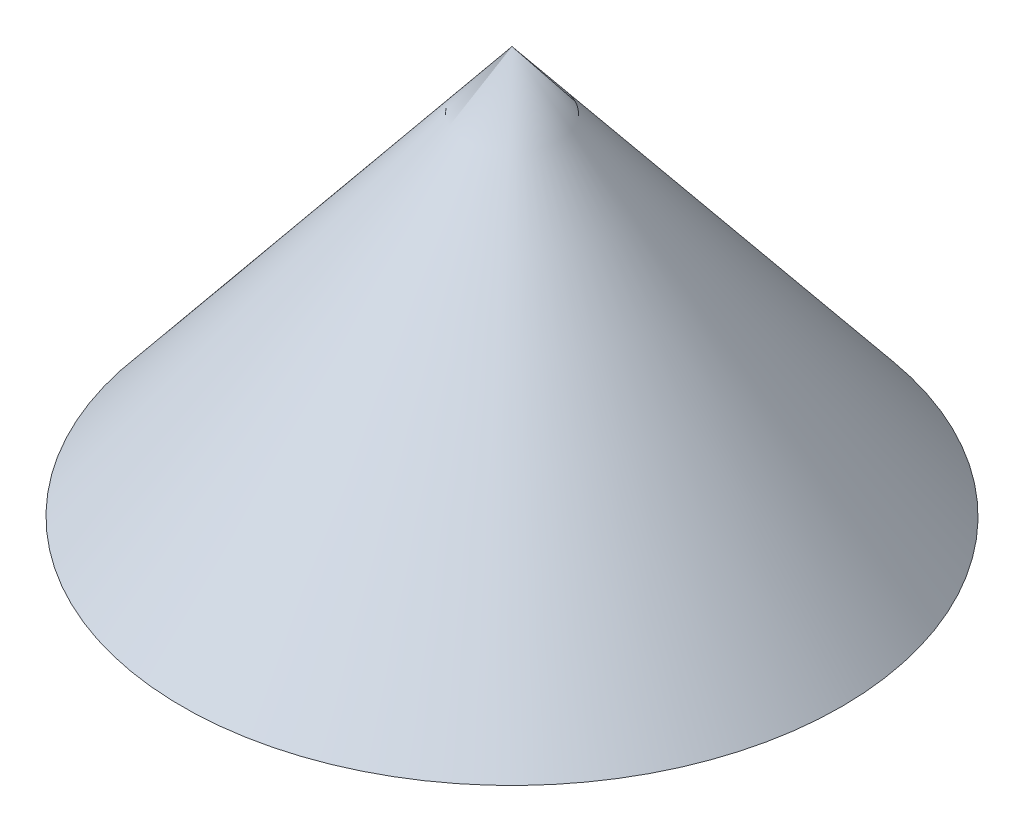
ISO-10303-21;
HEADER;
FILE_DESCRIPTION(('STEP AP214'),'2;1');
FILE_NAME('part.step','',(''),(''),'','','');
FILE_SCHEMA(('AUTOMOTIVE_DESIGN { 1 0 10303 214 1 1 1 1 }'));
ENDSEC;
DATA;
#1=APPLICATION_CONTEXT('core data for automotive mechanical design processes');
#2=APPLICATION_PROTOCOL_DEFINITION('international standard','automotive_design',2000,#1);
#3=PRODUCT_CONTEXT('',#1,'mechanical');
#4=PRODUCT('Part','Part','',(#3));
#5=PRODUCT_RELATED_PRODUCT_CATEGORY('part','',(#4));
#6=PRODUCT_DEFINITION_FORMATION('','',#4);
#7=PRODUCT_DEFINITION_CONTEXT('part definition',#1,'design');
#8=PRODUCT_DEFINITION('design','',#6,#7);
#9=PRODUCT_DEFINITION_SHAPE('','',#8);
#10=(LENGTH_UNIT() NAMED_UNIT(*) SI_UNIT(.MILLI.,.METRE.));
#11=(NAMED_UNIT(*) PLANE_ANGLE_UNIT() SI_UNIT($,.RADIAN.));
#12=(NAMED_UNIT(*) SI_UNIT($,.STERADIAN.) SOLID_ANGLE_UNIT());
#13=UNCERTAINTY_MEASURE_WITH_UNIT(LENGTH_MEASURE(1.E-05),#10,'distance_accuracy_value','');
#14=(GEOMETRIC_REPRESENTATION_CONTEXT(3) GLOBAL_UNCERTAINTY_ASSIGNED_CONTEXT((#13)) GLOBAL_UNIT_ASSIGNED_CONTEXT((#10,
#11,#12)) REPRESENTATION_CONTEXT('',''));
#15=CARTESIAN_POINT('',(0.,0.,0.));
#16=DIRECTION('',(0.,0.,1.));
#17=DIRECTION('',(1.,0.,0.));
#18=AXIS2_PLACEMENT_3D('',#15,#16,#17);
#19=CARTESIAN_POINT('',(6.57252030578121E-13,-5.68434188608079E-13,-3.55271367880023E-13));
#20=DIRECTION('',(0.,1.,0.));
#21=DIRECTION('',(1.,0.,0.));
#22=AXIS2_PLACEMENT_3D('',#19,#20,#21);
#23=PLANE('',#22);
#24=CARTESIAN_POINT('',(6.57252030578121E-13,-5.68434188608079E-13,-3.55271367880023E-13));
#25=DIRECTION('',(0.,1.,0.));
#26=DIRECTION('',(-0.43670417605379,0.,0.899605170403761));
#27=AXIS2_PLACEMENT_3D('',#24,#25,#26);
#28=CIRCLE('',#27,1.01487252386249);
#29=CARTESIAN_POINT('',(0.443199069333731,-5.53233486897507E-13,-0.912984569767674));
#30=VERTEX_POINT('',#29);
#31=EDGE_CURVE('E10',#30,#30,#28,.T.);
#32=ORIENTED_EDGE('',*,*,#31,.F.);
#33=EDGE_LOOP('',(#32));
#34=FACE_BOUND('',#33,.T.);
#35=ADVANCED_FACE('F15',(#34),#23,.F.);
#36=CARTESIAN_POINT('',(6.57252030578121E-13,-5.68434188608079E-13,-3.55271367880023E-13));
#37=DIRECTION('',(0.,-1.,0.));
#38=DIRECTION('',(-0.43670417605379,0.,0.899605170403761));
#39=AXIS2_PLACEMENT_3D('',#36,#37,#38);
#40=CONICAL_SURFACE('',#39,1.01487252386249,0.680678408277788);
#41=DIRECTION('',(0.27482684284727,-0.777145961456967,-0.566139877628955));
#42=VECTOR('',#41,1.);
#43=CARTESIAN_POINT('',(0.443199069333658,-5.53116179176094E-13,-0.912984569767769));
#44=LINE('',#43,#42);
#45=CARTESIAN_POINT('',(5.62590279822512E-13,1.25326319396294,-1.69264098548919E-13));
#46=VERTEX_POINT('',#45);
#47=EDGE_CURVE('E19',#46,#30,#44,.T.);
#48=ORIENTED_EDGE('',*,*,#47,.T.);
#49=ORIENTED_EDGE('',*,*,#31,.T.);
#50=ORIENTED_EDGE('',*,*,#47,.F.);
#51=EDGE_LOOP('',(#48,#49,#50));
#52=FACE_BOUND('',#51,.T.);
#53=ADVANCED_FACE('F17',(#52),#40,.T.);
#54=CLOSED_SHELL('',(#35,#53));
#55=MANIFOLD_SOLID_BREP('B1',#54);
#56=ADVANCED_BREP_SHAPE_REPRESENTATION('',(#18,#55),#14);
#57=SHAPE_DEFINITION_REPRESENTATION(#9,#56);
ENDSEC;
END-ISO-10303-21;
